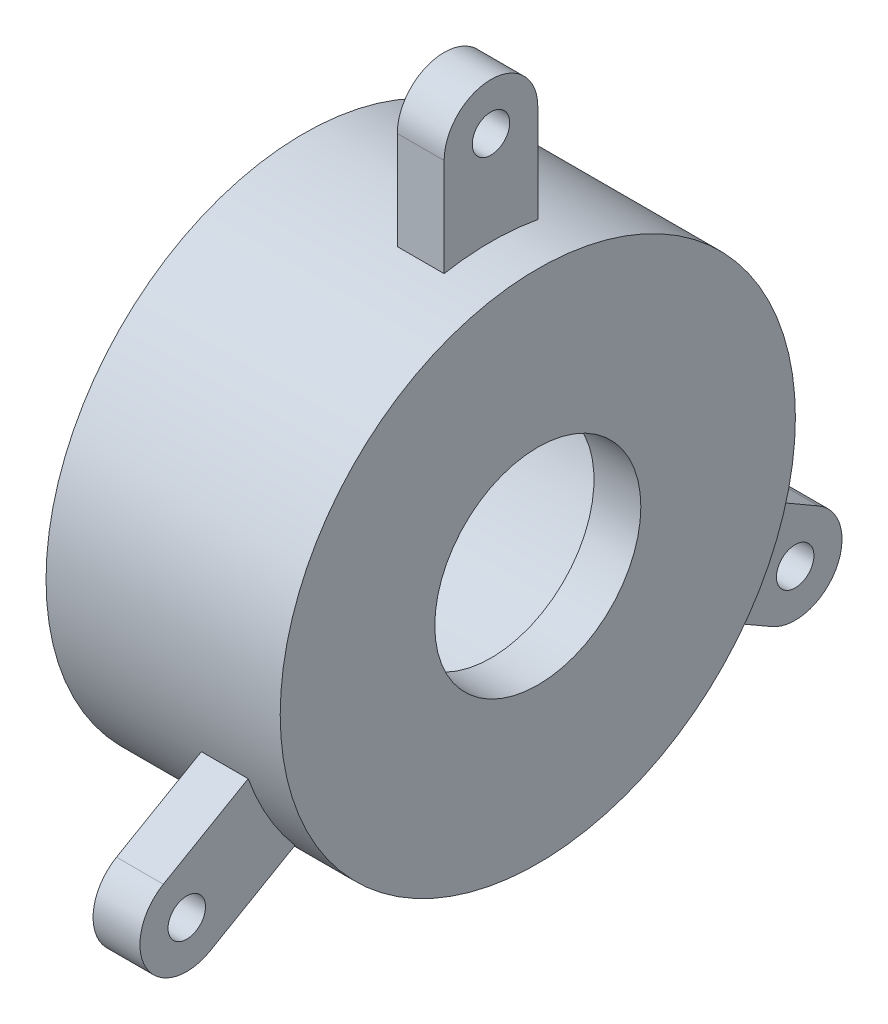
ISO-10303-21;
HEADER;
FILE_DESCRIPTION(('STEP AP214'),'2;1');
FILE_NAME('part.step','',(''),(''),'','','');
FILE_SCHEMA(('AUTOMOTIVE_DESIGN { 1 0 10303 214 1 1 1 1 }'));
ENDSEC;
DATA;
#1=APPLICATION_CONTEXT('core data for automotive mechanical design processes');
#2=APPLICATION_PROTOCOL_DEFINITION('international standard','automotive_design',2000,#1);
#3=PRODUCT_CONTEXT('',#1,'mechanical');
#4=PRODUCT('Part','Part','',(#3));
#5=PRODUCT_RELATED_PRODUCT_CATEGORY('part','',(#4));
#6=PRODUCT_DEFINITION_FORMATION('','',#4);
#7=PRODUCT_DEFINITION_CONTEXT('part definition',#1,'design');
#8=PRODUCT_DEFINITION('design','',#6,#7);
#9=PRODUCT_DEFINITION_SHAPE('','',#8);
#10=(LENGTH_UNIT() NAMED_UNIT(*) SI_UNIT(.MILLI.,.METRE.));
#11=(NAMED_UNIT(*) PLANE_ANGLE_UNIT() SI_UNIT($,.RADIAN.));
#12=(NAMED_UNIT(*) SI_UNIT($,.STERADIAN.) SOLID_ANGLE_UNIT());
#13=UNCERTAINTY_MEASURE_WITH_UNIT(LENGTH_MEASURE(1.E-05),#10,'distance_accuracy_value','');
#14=(GEOMETRIC_REPRESENTATION_CONTEXT(3) GLOBAL_UNCERTAINTY_ASSIGNED_CONTEXT((#13)) GLOBAL_UNIT_ASSIGNED_CONTEXT((#10,
#11,#12)) REPRESENTATION_CONTEXT('',''));
#15=CARTESIAN_POINT('',(0.,0.,0.));
#16=DIRECTION('',(0.,0.,1.));
#17=DIRECTION('',(1.,0.,0.));
#18=AXIS2_PLACEMENT_3D('',#15,#16,#17);
#19=CARTESIAN_POINT('',(-32.4507817086863,0.,0.));
#20=DIRECTION('',(-1.,0.,0.));
#21=DIRECTION('',(0.,0.,1.));
#22=AXIS2_PLACEMENT_3D('',#19,#20,#21);
#23=CYLINDRICAL_SURFACE('',#22,55.);
#24=CARTESIAN_POINT('',(30.,0.,0.));
#25=DIRECTION('',(1.,0.,0.));
#26=DIRECTION('',(0.,0.,-1.));
#27=AXIS2_PLACEMENT_3D('',#24,#25,#26);
#28=CIRCLE('',#27,55.);
#29=CARTESIAN_POINT('',(30.,-18.381380528135,51.8374849879882));
#30=VERTEX_POINT('',#29);
#31=CARTESIAN_POINT('',(30.,-35.7018886038239,41.8374849879883));
#32=VERTEX_POINT('',#31);
#33=EDGE_CURVE('E11',#30,#32,#28,.T.);
#34=ORIENTED_EDGE('',*,*,#33,.F.);
#35=DIRECTION('',(-1.,0.,0.));
#36=VECTOR('',#35,1.);
#37=CARTESIAN_POINT('',(-32.4507817086863,-18.381380528135,51.8374849879882));
#38=LINE('',#37,#36);
#39=CARTESIAN_POINT('',(40.,-18.381380528135,51.8374849879882));
#40=VERTEX_POINT('',#39);
#41=EDGE_CURVE('E43',#30,#40,#38,.F.);
#42=ORIENTED_EDGE('',*,*,#41,.T.);
#43=CARTESIAN_POINT('',(40.,0.,0.));
#44=DIRECTION('',(1.,0.,0.));
#45=DIRECTION('',(0.,0.,-1.));
#46=AXIS2_PLACEMENT_3D('',#43,#44,#45);
#47=CIRCLE('',#46,55.);
#48=CARTESIAN_POINT('',(40.,-35.7018886038239,41.8374849879883));
#49=VERTEX_POINT('',#48);
#50=EDGE_CURVE('E242',#40,#49,#47,.T.);
#51=ORIENTED_EDGE('',*,*,#50,.T.);
#52=DIRECTION('',(-1.,0.,0.));
#53=VECTOR('',#52,1.);
#54=CARTESIAN_POINT('',(-32.4507817086863,-35.7018886038239,41.8374849879883));
#55=LINE('',#54,#53);
#56=EDGE_CURVE('E245',#49,#32,#55,.T.);
#57=ORIENTED_EDGE('',*,*,#56,.T.);
#58=EDGE_LOOP('',(#34,#42,#51,#57));
#59=FACE_BOUND('',#58,.T.);
#60=CARTESIAN_POINT('',(30.,0.,0.));
#61=DIRECTION('',(1.,0.,0.));
#62=DIRECTION('',(0.,0.,-1.));
#63=AXIS2_PLACEMENT_3D('',#60,#61,#62);
#64=CIRCLE('',#63,55.);
#65=CARTESIAN_POINT('',(30.,54.0832691319598,-10.));
#66=VERTEX_POINT('',#65);
#67=CARTESIAN_POINT('',(30.,54.0832691319598,10.));
#68=VERTEX_POINT('',#67);
#69=EDGE_CURVE('E229',#66,#68,#64,.T.);
#70=ORIENTED_EDGE('',*,*,#69,.F.);
#71=DIRECTION('',(-1.,0.,0.));
#72=VECTOR('',#71,1.);
#73=CARTESIAN_POINT('',(-32.4507817086863,54.0832691319598,-10.));
#74=LINE('',#73,#72);
#75=CARTESIAN_POINT('',(40.,54.0832691319598,-10.));
#76=VERTEX_POINT('',#75);
#77=EDGE_CURVE('E226',#66,#76,#74,.F.);
#78=ORIENTED_EDGE('',*,*,#77,.T.);
#79=CARTESIAN_POINT('',(40.,0.,0.));
#80=DIRECTION('',(1.,0.,0.));
#81=DIRECTION('',(0.,0.,-1.));
#82=AXIS2_PLACEMENT_3D('',#79,#80,#81);
#83=CIRCLE('',#82,55.);
#84=CARTESIAN_POINT('',(40.,54.0832691319598,10.));
#85=VERTEX_POINT('',#84);
#86=EDGE_CURVE('E220',#76,#85,#83,.T.);
#87=ORIENTED_EDGE('',*,*,#86,.T.);
#88=DIRECTION('',(-1.,0.,0.));
#89=VECTOR('',#88,1.);
#90=CARTESIAN_POINT('',(-32.4507817086863,54.0832691319598,10.));
#91=LINE('',#90,#89);
#92=EDGE_CURVE('E223',#85,#68,#91,.T.);
#93=ORIENTED_EDGE('',*,*,#92,.T.);
#94=EDGE_LOOP('',(#70,#78,#87,#93));
#95=FACE_BOUND('',#94,.T.);
#96=CARTESIAN_POINT('',(0.,0.,0.));
#97=DIRECTION('',(-1.,0.,0.));
#98=DIRECTION('',(0.,0.,1.));
#99=AXIS2_PLACEMENT_3D('',#96,#97,#98);
#100=CIRCLE('',#99,55.);
#101=CARTESIAN_POINT('',(0.,0.,55.));
#102=VERTEX_POINT('',#101);
#103=EDGE_CURVE('E207',#102,#102,#100,.T.);
#104=ORIENTED_EDGE('',*,*,#103,.F.);
#105=EDGE_LOOP('',(#104));
#106=FACE_BOUND('',#105,.T.);
#107=CARTESIAN_POINT('',(30.,0.,0.));
#108=DIRECTION('',(1.,0.,0.));
#109=DIRECTION('',(0.,0.,-1.));
#110=AXIS2_PLACEMENT_3D('',#107,#108,#109);
#111=CIRCLE('',#110,55.);
#112=CARTESIAN_POINT('',(30.,-35.7018886038245,-41.8374849879878));
#113=VERTEX_POINT('',#112);
#114=CARTESIAN_POINT('',(30.,-18.3813805281358,-51.8374849879879));
#115=VERTEX_POINT('',#114);
#116=EDGE_CURVE('E240',#113,#115,#111,.T.);
#117=ORIENTED_EDGE('',*,*,#116,.F.);
#118=DIRECTION('',(-1.,0.,0.));
#119=VECTOR('',#118,1.);
#120=CARTESIAN_POINT('',(-32.4507817086863,-35.7018886038245,-41.8374849879878));
#121=LINE('',#120,#119);
#122=CARTESIAN_POINT('',(40.,-35.7018886038245,-41.8374849879878));
#123=VERTEX_POINT('',#122);
#124=EDGE_CURVE('E237',#113,#123,#121,.F.);
#125=ORIENTED_EDGE('',*,*,#124,.T.);
#126=CARTESIAN_POINT('',(40.,0.,0.));
#127=DIRECTION('',(1.,0.,0.));
#128=DIRECTION('',(0.,0.,-1.));
#129=AXIS2_PLACEMENT_3D('',#126,#127,#128);
#130=CIRCLE('',#129,55.);
#131=CARTESIAN_POINT('',(40.,-18.3813805281358,-51.8374849879879));
#132=VERTEX_POINT('',#131);
#133=EDGE_CURVE('E231',#123,#132,#130,.T.);
#134=ORIENTED_EDGE('',*,*,#133,.T.);
#135=DIRECTION('',(-1.,0.,0.));
#136=VECTOR('',#135,1.);
#137=CARTESIAN_POINT('',(-32.4507817086863,-18.3813805281358,-51.8374849879879));
#138=LINE('',#137,#136);
#139=EDGE_CURVE('E234',#132,#115,#138,.T.);
#140=ORIENTED_EDGE('',*,*,#139,.T.);
#141=EDGE_LOOP('',(#117,#125,#134,#140));
#142=FACE_BOUND('',#141,.T.);
#143=CARTESIAN_POINT('',(50.,0.,0.));
#144=DIRECTION('',(1.,0.,0.));
#145=DIRECTION('',(0.,0.,-1.));
#146=AXIS2_PLACEMENT_3D('',#143,#144,#145);
#147=CIRCLE('',#146,55.);
#148=CARTESIAN_POINT('',(50.,0.,-55.));
#149=VERTEX_POINT('',#148);
#150=EDGE_CURVE('E260',#149,#149,#147,.T.);
#151=ORIENTED_EDGE('',*,*,#150,.F.);
#152=EDGE_LOOP('',(#151));
#153=FACE_BOUND('',#152,.T.);
#154=ADVANCED_FACE('F36',(#59,#95,#106,#142,#153),#23,.T.);
#155=CARTESIAN_POINT('',(-32.4507817086863,0.,0.));
#156=DIRECTION('',(-1.,0.,0.));
#157=DIRECTION('',(0.,0.,1.));
#158=AXIS2_PLACEMENT_3D('',#155,#156,#157);
#159=CYLINDRICAL_SURFACE('',#158,22.);
#160=CARTESIAN_POINT('',(40.,0.,0.));
#161=DIRECTION('',(-1.,0.,0.));
#162=DIRECTION('',(0.,0.,1.));
#163=AXIS2_PLACEMENT_3D('',#160,#161,#162);
#164=CIRCLE('',#163,22.);
#165=CARTESIAN_POINT('',(40.,0.,22.));
#166=VERTEX_POINT('',#165);
#167=EDGE_CURVE('E217',#166,#166,#164,.T.);
#168=ORIENTED_EDGE('',*,*,#167,.T.);
#169=EDGE_LOOP('',(#168));
#170=FACE_BOUND('',#169,.T.);
#171=CARTESIAN_POINT('',(50.,0.,0.));
#172=DIRECTION('',(1.,0.,0.));
#173=DIRECTION('',(0.,0.,-1.));
#174=AXIS2_PLACEMENT_3D('',#171,#172,#173);
#175=CIRCLE('',#174,22.);
#176=CARTESIAN_POINT('',(50.,0.,-22.));
#177=VERTEX_POINT('',#176);
#178=EDGE_CURVE('E263',#177,#177,#175,.T.);
#179=ORIENTED_EDGE('',*,*,#178,.T.);
#180=EDGE_LOOP('',(#179));
#181=FACE_BOUND('',#180,.T.);
#182=ADVANCED_FACE('F271',(#170,#181),#159,.F.);
#183=CARTESIAN_POINT('',(40.,40.,0.));
#184=DIRECTION('',(1.,0.,0.));
#185=DIRECTION('',(0.,0.,-1.));
#186=AXIS2_PLACEMENT_3D('',#183,#184,#185);
#187=PLANE('',#186);
#188=ORIENTED_EDGE('',*,*,#167,.F.);
#189=EDGE_LOOP('',(#188));
#190=FACE_BOUND('',#189,.T.);
#191=CARTESIAN_POINT('',(40.,0.,0.));
#192=DIRECTION('',(-1.,0.,0.));
#193=DIRECTION('',(0.,0.,1.));
#194=AXIS2_PLACEMENT_3D('',#191,#192,#193);
#195=CIRCLE('',#194,40.);
#196=CARTESIAN_POINT('',(40.,0.,40.));
#197=VERTEX_POINT('',#196);
#198=EDGE_CURVE('E214',#197,#197,#195,.T.);
#199=ORIENTED_EDGE('',*,*,#198,.T.);
#200=EDGE_LOOP('',(#199));
#201=FACE_BOUND('',#200,.T.);
#202=ADVANCED_FACE('F285',(#190,#201),#187,.F.);
#203=CARTESIAN_POINT('',(-32.4507817086863,0.,0.));
#204=DIRECTION('',(-1.,0.,0.));
#205=DIRECTION('',(0.,0.,1.));
#206=AXIS2_PLACEMENT_3D('',#203,#204,#205);
#207=CYLINDRICAL_SURFACE('',#206,40.);
#208=ORIENTED_EDGE('',*,*,#198,.F.);
#209=EDGE_LOOP('',(#208));
#210=FACE_BOUND('',#209,.T.);
#211=CARTESIAN_POINT('',(0.,0.,0.));
#212=DIRECTION('',(-1.,0.,0.));
#213=DIRECTION('',(0.,0.,1.));
#214=AXIS2_PLACEMENT_3D('',#211,#212,#213);
#215=CIRCLE('',#214,40.);
#216=CARTESIAN_POINT('',(0.,0.,40.));
#217=VERTEX_POINT('',#216);
#218=EDGE_CURVE('E211',#217,#217,#215,.T.);
#219=ORIENTED_EDGE('',*,*,#218,.T.);
#220=EDGE_LOOP('',(#219));
#221=FACE_BOUND('',#220,.T.);
#222=ADVANCED_FACE('F290',(#210,#221),#207,.F.);
#223=CARTESIAN_POINT('',(0.,40.,0.));
#224=DIRECTION('',(1.,0.,0.));
#225=DIRECTION('',(0.,0.,-1.));
#226=AXIS2_PLACEMENT_3D('',#223,#224,#225);
#227=PLANE('',#226);
#228=ORIENTED_EDGE('',*,*,#218,.F.);
#229=EDGE_LOOP('',(#228));
#230=FACE_BOUND('',#229,.T.);
#231=ORIENTED_EDGE('',*,*,#103,.T.);
#232=EDGE_LOOP('',(#231));
#233=FACE_BOUND('',#232,.T.);
#234=ADVANCED_FACE('F296',(#230,#233),#227,.F.);
#235=CARTESIAN_POINT('',(30.,51.1005512482579,-10.));
#236=DIRECTION('',(0.,0.,-1.));
#237=DIRECTION('',(-1.,0.,0.));
#238=AXIS2_PLACEMENT_3D('',#235,#236,#237);
#239=PLANE('',#238);
#240=ORIENTED_EDGE('',*,*,#77,.F.);
#241=DIRECTION('',(0.,1.,0.));
#242=VECTOR('',#241,1.);
#243=CARTESIAN_POINT('',(30.,51.1005512482579,-10.));
#244=LINE('',#243,#242);
#245=CARTESIAN_POINT('',(30.,75.,-10.));
#246=VERTEX_POINT('',#245);
#247=EDGE_CURVE('E196',#66,#246,#244,.T.);
#248=ORIENTED_EDGE('',*,*,#247,.T.);
#249=DIRECTION('',(1.,0.,0.));
#250=VECTOR('',#249,1.);
#251=CARTESIAN_POINT('',(30.,75.,-10.));
#252=LINE('',#251,#250);
#253=CARTESIAN_POINT('',(40.,75.,-10.));
#254=VERTEX_POINT('',#253);
#255=EDGE_CURVE('E204',#246,#254,#252,.T.);
#256=ORIENTED_EDGE('',*,*,#255,.T.);
#257=DIRECTION('',(0.,1.,0.));
#258=VECTOR('',#257,1.);
#259=CARTESIAN_POINT('',(40.,51.1005512482579,-10.));
#260=LINE('',#259,#258);
#261=EDGE_CURVE('E193',#76,#254,#260,.T.);
#262=ORIENTED_EDGE('',*,*,#261,.F.);
#263=EDGE_LOOP('',(#240,#248,#256,#262));
#264=FACE_BOUND('',#263,.T.);
#265=ADVANCED_FACE('F300',(#264),#239,.T.);
#266=CARTESIAN_POINT('',(30.,51.1005512482579,10.));
#267=DIRECTION('',(0.,0.,1.));
#268=DIRECTION('',(1.,0.,0.));
#269=AXIS2_PLACEMENT_3D('',#266,#267,#268);
#270=PLANE('',#269);
#271=ORIENTED_EDGE('',*,*,#92,.F.);
#272=DIRECTION('',(0.,-1.,0.));
#273=VECTOR('',#272,1.);
#274=CARTESIAN_POINT('',(40.,51.1005512482579,10.));
#275=LINE('',#274,#273);
#276=CARTESIAN_POINT('',(40.,75.,10.));
#277=VERTEX_POINT('',#276);
#278=EDGE_CURVE('E201',#277,#85,#275,.T.);
#279=ORIENTED_EDGE('',*,*,#278,.F.);
#280=DIRECTION('',(1.,0.,0.));
#281=VECTOR('',#280,1.);
#282=CARTESIAN_POINT('',(30.,75.,10.));
#283=LINE('',#282,#281);
#284=CARTESIAN_POINT('',(30.,75.,10.));
#285=VERTEX_POINT('',#284);
#286=EDGE_CURVE('E198',#285,#277,#283,.T.);
#287=ORIENTED_EDGE('',*,*,#286,.F.);
#288=DIRECTION('',(0.,-1.,0.));
#289=VECTOR('',#288,1.);
#290=CARTESIAN_POINT('',(30.,51.1005512482579,10.));
#291=LINE('',#290,#289);
#292=EDGE_CURVE('E192',#285,#68,#291,.T.);
#293=ORIENTED_EDGE('',*,*,#292,.T.);
#294=EDGE_LOOP('',(#271,#279,#287,#293));
#295=FACE_BOUND('',#294,.T.);
#296=ADVANCED_FACE('F306',(#295),#270,.T.);
#297=CARTESIAN_POINT('',(30.,75.,0.));
#298=DIRECTION('',(1.,0.,0.));
#299=DIRECTION('',(0.,0.,-1.));
#300=AXIS2_PLACEMENT_3D('',#297,#298,#299);
#301=CYLINDRICAL_SURFACE('',#300,10.);
#302=CARTESIAN_POINT('',(40.,75.,0.));
#303=DIRECTION('',(1.,0.,0.));
#304=DIRECTION('',(0.,0.,-1.));
#305=AXIS2_PLACEMENT_3D('',#302,#303,#304);
#306=CIRCLE('',#305,10.);
#307=EDGE_CURVE('E186',#254,#277,#306,.T.);
#308=ORIENTED_EDGE('',*,*,#307,.F.);
#309=ORIENTED_EDGE('',*,*,#255,.F.);
#310=CARTESIAN_POINT('',(30.,75.,0.));
#311=DIRECTION('',(1.,0.,0.));
#312=DIRECTION('',(0.,0.,-1.));
#313=AXIS2_PLACEMENT_3D('',#310,#311,#312);
#314=CIRCLE('',#313,10.);
#315=EDGE_CURVE('E189',#246,#285,#314,.T.);
#316=ORIENTED_EDGE('',*,*,#315,.T.);
#317=ORIENTED_EDGE('',*,*,#286,.T.);
#318=EDGE_LOOP('',(#308,#309,#316,#317));
#319=FACE_BOUND('',#318,.T.);
#320=ADVANCED_FACE('F302',(#319),#301,.T.);
#321=CARTESIAN_POINT('',(30.,75.,0.));
#322=DIRECTION('',(1.,0.,0.));
#323=DIRECTION('',(0.,0.,-1.));
#324=AXIS2_PLACEMENT_3D('',#321,#322,#323);
#325=PLANE('',#324);
#326=CARTESIAN_POINT('',(30.,75.,0.));
#327=DIRECTION('',(1.,0.,0.));
#328=DIRECTION('',(0.,0.,-1.));
#329=AXIS2_PLACEMENT_3D('',#326,#327,#328);
#330=CIRCLE('',#329,4.);
#331=CARTESIAN_POINT('',(30.,75.,-4.));
#332=VERTEX_POINT('',#331);
#333=EDGE_CURVE('E183',#332,#332,#330,.T.);
#334=ORIENTED_EDGE('',*,*,#333,.T.);
#335=EDGE_LOOP('',(#334));
#336=FACE_BOUND('',#335,.T.);
#337=ORIENTED_EDGE('',*,*,#247,.F.);
#338=ORIENTED_EDGE('',*,*,#69,.T.);
#339=ORIENTED_EDGE('',*,*,#292,.F.);
#340=ORIENTED_EDGE('',*,*,#315,.F.);
#341=EDGE_LOOP('',(#337,#338,#339,#340));
#342=FACE_BOUND('',#341,.T.);
#343=ADVANCED_FACE('F305',(#336,#342),#325,.F.);
#344=CARTESIAN_POINT('',(40.,75.,0.));
#345=DIRECTION('',(1.,0.,0.));
#346=DIRECTION('',(0.,0.,-1.));
#347=AXIS2_PLACEMENT_3D('',#344,#345,#346);
#348=PLANE('',#347);
#349=ORIENTED_EDGE('',*,*,#86,.F.);
#350=ORIENTED_EDGE('',*,*,#261,.T.);
#351=ORIENTED_EDGE('',*,*,#307,.T.);
#352=ORIENTED_EDGE('',*,*,#278,.T.);
#353=EDGE_LOOP('',(#349,#350,#351,#352));
#354=FACE_BOUND('',#353,.T.);
#355=CARTESIAN_POINT('',(40.,75.,0.));
#356=DIRECTION('',(1.,0.,0.));
#357=DIRECTION('',(0.,0.,-1.));
#358=AXIS2_PLACEMENT_3D('',#355,#356,#357);
#359=CIRCLE('',#358,4.);
#360=CARTESIAN_POINT('',(40.,75.,-4.));
#361=VERTEX_POINT('',#360);
#362=EDGE_CURVE('E181',#361,#361,#359,.T.);
#363=ORIENTED_EDGE('',*,*,#362,.F.);
#364=EDGE_LOOP('',(#363));
#365=FACE_BOUND('',#364,.T.);
#366=ADVANCED_FACE('F314',(#354,#365),#348,.T.);
#367=CARTESIAN_POINT('',(30.,75.,0.));
#368=DIRECTION('',(1.,0.,0.));
#369=DIRECTION('',(0.,0.,-1.));
#370=AXIS2_PLACEMENT_3D('',#367,#368,#369);
#371=CYLINDRICAL_SURFACE('',#370,4.);
#372=ORIENTED_EDGE('',*,*,#333,.F.);
#373=EDGE_LOOP('',(#372));
#374=FACE_BOUND('',#373,.T.);
#375=ORIENTED_EDGE('',*,*,#362,.T.);
#376=EDGE_LOOP('',(#375));
#377=FACE_BOUND('',#376,.T.);
#378=ADVANCED_FACE('F317',(#374,#377),#371,.F.);
#379=CARTESIAN_POINT('',(30.,-34.2105296619735,-39.2543755283798));
#380=DIRECTION('',(0.,-0.866025403784436,0.500000000000004));
#381=DIRECTION('',(0.,-0.500000000000004,-0.866025403784436));
#382=AXIS2_PLACEMENT_3D('',#379,#380,#381);
#383=PLANE('',#382);
#384=ORIENTED_EDGE('',*,*,#124,.F.);
#385=DIRECTION('',(0.,-0.500000000000004,-0.866025403784436));
#386=VECTOR('',#385,1.);
#387=CARTESIAN_POINT('',(30.,-34.2105296619735,-39.2543755283798));
#388=LINE('',#387,#386);
#389=CARTESIAN_POINT('',(30.,-46.1602540378447,-59.9519052838327));
#390=VERTEX_POINT('',#389);
#391=EDGE_CURVE('E172',#113,#390,#388,.T.);
#392=ORIENTED_EDGE('',*,*,#391,.T.);
#393=DIRECTION('',(1.,0.,0.));
#394=VECTOR('',#393,1.);
#395=CARTESIAN_POINT('',(30.,-46.1602540378447,-59.9519052838327));
#396=LINE('',#395,#394);
#397=CARTESIAN_POINT('',(40.,-46.1602540378447,-59.9519052838327));
#398=VERTEX_POINT('',#397);
#399=EDGE_CURVE('E178',#390,#398,#396,.T.);
#400=ORIENTED_EDGE('',*,*,#399,.T.);
#401=DIRECTION('',(0.,-0.500000000000004,-0.866025403784436));
#402=VECTOR('',#401,1.);
#403=CARTESIAN_POINT('',(40.,-34.2105296619735,-39.2543755283798));
#404=LINE('',#403,#402);
#405=EDGE_CURVE('E169',#123,#398,#404,.T.);
#406=ORIENTED_EDGE('',*,*,#405,.F.);
#407=EDGE_LOOP('',(#384,#392,#400,#406));
#408=FACE_BOUND('',#407,.T.);
#409=ADVANCED_FACE('F324',(#408),#383,.T.);
#410=CARTESIAN_POINT('',(30.,-16.8900215862848,-49.2543755283799));
#411=DIRECTION('',(0.,0.866025403784436,-0.500000000000004));
#412=DIRECTION('',(0.,0.500000000000004,0.866025403784436));
#413=AXIS2_PLACEMENT_3D('',#410,#411,#412);
#414=PLANE('',#413);
#415=ORIENTED_EDGE('',*,*,#139,.F.);
#416=DIRECTION('',(0.,0.500000000000004,0.866025403784436));
#417=VECTOR('',#416,1.);
#418=CARTESIAN_POINT('',(40.,-16.8900215862848,-49.2543755283799));
#419=LINE('',#418,#417);
#420=CARTESIAN_POINT('',(40.,-28.8397459621559,-69.9519052838328));
#421=VERTEX_POINT('',#420);
#422=EDGE_CURVE('E58',#421,#132,#419,.T.);
#423=ORIENTED_EDGE('',*,*,#422,.F.);
#424=DIRECTION('',(1.,0.,0.));
#425=VECTOR('',#424,1.);
#426=CARTESIAN_POINT('',(30.,-28.8397459621559,-69.9519052838328));
#427=LINE('',#426,#425);
#428=CARTESIAN_POINT('',(30.,-28.8397459621559,-69.9519052838328));
#429=VERTEX_POINT('',#428);
#430=EDGE_CURVE('E174',#429,#421,#427,.T.);
#431=ORIENTED_EDGE('',*,*,#430,.F.);
#432=DIRECTION('',(0.,0.500000000000004,0.866025403784436));
#433=VECTOR('',#432,1.);
#434=CARTESIAN_POINT('',(30.,-16.8900215862848,-49.2543755283799));
#435=LINE('',#434,#433);
#436=EDGE_CURVE('E168',#429,#115,#435,.T.);
#437=ORIENTED_EDGE('',*,*,#436,.T.);
#438=EDGE_LOOP('',(#415,#423,#431,#437));
#439=FACE_BOUND('',#438,.T.);
#440=ADVANCED_FACE('F330',(#439),#414,.T.);
#441=CARTESIAN_POINT('',(30.,-37.5000000000003,-64.9519052838327));
#442=DIRECTION('',(1.,0.,0.));
#443=DIRECTION('',(0.,0.,-1.));
#444=AXIS2_PLACEMENT_3D('',#441,#442,#443);
#445=CYLINDRICAL_SURFACE('',#444,10.);
#446=CARTESIAN_POINT('',(40.,-37.5000000000003,-64.9519052838327));
#447=DIRECTION('',(1.,0.,0.));
#448=DIRECTION('',(0.,-0.866025403784436,0.500000000000004));
#449=AXIS2_PLACEMENT_3D('',#446,#447,#448);
#450=CIRCLE('',#449,10.);
#451=EDGE_CURVE('E162',#398,#421,#450,.T.);
#452=ORIENTED_EDGE('',*,*,#451,.F.);
#453=ORIENTED_EDGE('',*,*,#399,.F.);
#454=CARTESIAN_POINT('',(30.,-37.5000000000003,-64.9519052838327));
#455=DIRECTION('',(1.,0.,0.));
#456=DIRECTION('',(0.,-0.866025403784436,0.500000000000004));
#457=AXIS2_PLACEMENT_3D('',#454,#455,#456);
#458=CIRCLE('',#457,10.);
#459=EDGE_CURVE('E165',#390,#429,#458,.T.);
#460=ORIENTED_EDGE('',*,*,#459,.T.);
#461=ORIENTED_EDGE('',*,*,#430,.T.);
#462=EDGE_LOOP('',(#452,#453,#460,#461));
#463=FACE_BOUND('',#462,.T.);
#464=ADVANCED_FACE('F326',(#463),#445,.T.);
#465=CARTESIAN_POINT('',(30.,-37.5000000000003,-64.9519052838327));
#466=DIRECTION('',(1.,0.,0.));
#467=DIRECTION('',(0.,-0.866025403784436,0.500000000000004));
#468=AXIS2_PLACEMENT_3D('',#465,#466,#467);
#469=PLANE('',#468);
#470=CARTESIAN_POINT('',(30.,-37.5000000000003,-64.9519052838327));
#471=DIRECTION('',(1.,0.,0.));
#472=DIRECTION('',(0.,-0.866025403784436,0.500000000000004));
#473=AXIS2_PLACEMENT_3D('',#470,#471,#472);
#474=CIRCLE('',#473,4.);
#475=CARTESIAN_POINT('',(30.,-40.9641016151381,-62.9519052838327));
#476=VERTEX_POINT('',#475);
#477=EDGE_CURVE('E159',#476,#476,#474,.T.);
#478=ORIENTED_EDGE('',*,*,#477,.T.);
#479=EDGE_LOOP('',(#478));
#480=FACE_BOUND('',#479,.T.);
#481=ORIENTED_EDGE('',*,*,#391,.F.);
#482=ORIENTED_EDGE('',*,*,#116,.T.);
#483=ORIENTED_EDGE('',*,*,#436,.F.);
#484=ORIENTED_EDGE('',*,*,#459,.F.);
#485=EDGE_LOOP('',(#481,#482,#483,#484));
#486=FACE_BOUND('',#485,.T.);
#487=ADVANCED_FACE('F329',(#480,#486),#469,.F.);
#488=CARTESIAN_POINT('',(40.,-37.5000000000003,-64.9519052838327));
#489=DIRECTION('',(1.,0.,0.));
#490=DIRECTION('',(0.,-0.866025403784436,0.500000000000004));
#491=AXIS2_PLACEMENT_3D('',#488,#489,#490);
#492=PLANE('',#491);
#493=ORIENTED_EDGE('',*,*,#133,.F.);
#494=ORIENTED_EDGE('',*,*,#405,.T.);
#495=ORIENTED_EDGE('',*,*,#451,.T.);
#496=ORIENTED_EDGE('',*,*,#422,.T.);
#497=EDGE_LOOP('',(#493,#494,#495,#496));
#498=FACE_BOUND('',#497,.T.);
#499=CARTESIAN_POINT('',(40.,-37.5000000000003,-64.9519052838327));
#500=DIRECTION('',(1.,0.,0.));
#501=DIRECTION('',(0.,-0.866025403784436,0.500000000000004));
#502=AXIS2_PLACEMENT_3D('',#499,#500,#501);
#503=CIRCLE('',#502,4.);
#504=CARTESIAN_POINT('',(40.,-40.9641016151381,-62.9519052838327));
#505=VERTEX_POINT('',#504);
#506=EDGE_CURVE('E157',#505,#505,#503,.T.);
#507=ORIENTED_EDGE('',*,*,#506,.F.);
#508=EDGE_LOOP('',(#507));
#509=FACE_BOUND('',#508,.T.);
#510=ADVANCED_FACE('F338',(#498,#509),#492,.T.);
#511=CARTESIAN_POINT('',(30.,-37.5000000000003,-64.9519052838327));
#512=DIRECTION('',(1.,0.,0.));
#513=DIRECTION('',(0.,0.,-1.));
#514=AXIS2_PLACEMENT_3D('',#511,#512,#513);
#515=CYLINDRICAL_SURFACE('',#514,4.);
#516=ORIENTED_EDGE('',*,*,#477,.F.);
#517=EDGE_LOOP('',(#516));
#518=FACE_BOUND('',#517,.T.);
#519=ORIENTED_EDGE('',*,*,#506,.T.);
#520=EDGE_LOOP('',(#519));
#521=FACE_BOUND('',#520,.T.);
#522=ADVANCED_FACE('F341',(#518,#521),#515,.F.);
#523=CARTESIAN_POINT('',(30.,-16.8900215862841,49.2543755283801));
#524=DIRECTION('',(0.,0.866025403784443,0.499999999999992));
#525=DIRECTION('',(0.,-0.499999999999992,0.866025403784443));
#526=AXIS2_PLACEMENT_3D('',#523,#524,#525);
#527=PLANE('',#526);
#528=ORIENTED_EDGE('',*,*,#41,.F.);
#529=DIRECTION('',(0.,-0.499999999999992,0.866025403784443));
#530=VECTOR('',#529,1.);
#531=CARTESIAN_POINT('',(30.,-16.8900215862841,49.2543755283801));
#532=LINE('',#531,#530);
#533=CARTESIAN_POINT('',(30.,-28.839745962155,69.9519052838332));
#534=VERTEX_POINT('',#533);
#535=EDGE_CURVE('E133',#30,#534,#532,.T.);
#536=ORIENTED_EDGE('',*,*,#535,.T.);
#537=DIRECTION('',(1.,0.,0.));
#538=VECTOR('',#537,1.);
#539=CARTESIAN_POINT('',(30.,-28.839745962155,69.9519052838332));
#540=LINE('',#539,#538);
#541=CARTESIAN_POINT('',(40.,-28.839745962155,69.9519052838332));
#542=VERTEX_POINT('',#541);
#543=EDGE_CURVE('E132',#534,#542,#540,.T.);
#544=ORIENTED_EDGE('',*,*,#543,.T.);
#545=DIRECTION('',(0.,-0.499999999999992,0.866025403784443));
#546=VECTOR('',#545,1.);
#547=CARTESIAN_POINT('',(40.,-16.8900215862841,49.2543755283801));
#548=LINE('',#547,#546);
#549=EDGE_CURVE('E145',#40,#542,#548,.T.);
#550=ORIENTED_EDGE('',*,*,#549,.F.);
#551=EDGE_LOOP('',(#528,#536,#544,#550));
#552=FACE_BOUND('',#551,.T.);
#553=ADVANCED_FACE('F251',(#552),#527,.T.);
#554=CARTESIAN_POINT('',(30.,-34.210529661973,39.2543755283803));
#555=DIRECTION('',(0.,-0.866025403784443,-0.499999999999992));
#556=DIRECTION('',(0.,0.499999999999992,-0.866025403784443));
#557=AXIS2_PLACEMENT_3D('',#554,#555,#556);
#558=PLANE('',#557);
#559=ORIENTED_EDGE('',*,*,#56,.F.);
#560=DIRECTION('',(0.,0.499999999999992,-0.866025403784443));
#561=VECTOR('',#560,1.);
#562=CARTESIAN_POINT('',(40.,-34.210529661973,39.2543755283803));
#563=LINE('',#562,#561);
#564=CARTESIAN_POINT('',(40.,-46.1602540378438,59.9519052838333));
#565=VERTEX_POINT('',#564);
#566=EDGE_CURVE('E50',#565,#49,#563,.T.);
#567=ORIENTED_EDGE('',*,*,#566,.F.);
#568=DIRECTION('',(1.,0.,0.));
#569=VECTOR('',#568,1.);
#570=CARTESIAN_POINT('',(30.,-46.1602540378438,59.9519052838333));
#571=LINE('',#570,#569);
#572=CARTESIAN_POINT('',(30.,-46.1602540378438,59.9519052838333));
#573=VERTEX_POINT('',#572);
#574=EDGE_CURVE('E124',#573,#565,#571,.T.);
#575=ORIENTED_EDGE('',*,*,#574,.F.);
#576=DIRECTION('',(0.,0.499999999999992,-0.866025403784443));
#577=VECTOR('',#576,1.);
#578=CARTESIAN_POINT('',(30.,-34.210529661973,39.2543755283803));
#579=LINE('',#578,#577);
#580=EDGE_CURVE('E127',#573,#32,#579,.T.);
#581=ORIENTED_EDGE('',*,*,#580,.T.);
#582=EDGE_LOOP('',(#559,#567,#575,#581));
#583=FACE_BOUND('',#582,.T.);
#584=ADVANCED_FACE('F126',(#583),#558,.T.);
#585=CARTESIAN_POINT('',(30.,-37.4999999999994,64.9519052838332));
#586=DIRECTION('',(1.,0.,0.));
#587=DIRECTION('',(0.,0.,-1.));
#588=AXIS2_PLACEMENT_3D('',#585,#586,#587);
#589=CYLINDRICAL_SURFACE('',#588,10.);
#590=CARTESIAN_POINT('',(40.,-37.4999999999994,64.9519052838332));
#591=DIRECTION('',(1.,0.,0.));
#592=DIRECTION('',(0.,0.866025403784443,0.499999999999992));
#593=AXIS2_PLACEMENT_3D('',#590,#591,#592);
#594=CIRCLE('',#593,10.);
#595=EDGE_CURVE('E153',#542,#565,#594,.T.);
#596=ORIENTED_EDGE('',*,*,#595,.F.);
#597=ORIENTED_EDGE('',*,*,#543,.F.);
#598=CARTESIAN_POINT('',(30.,-37.4999999999994,64.9519052838332));
#599=DIRECTION('',(1.,0.,0.));
#600=DIRECTION('',(0.,0.866025403784443,0.499999999999992));
#601=AXIS2_PLACEMENT_3D('',#598,#599,#600);
#602=CIRCLE('',#601,10.);
#603=EDGE_CURVE('E139',#534,#573,#602,.T.);
#604=ORIENTED_EDGE('',*,*,#603,.T.);
#605=ORIENTED_EDGE('',*,*,#574,.T.);
#606=EDGE_LOOP('',(#596,#597,#604,#605));
#607=FACE_BOUND('',#606,.T.);
#608=ADVANCED_FACE('F143',(#607),#589,.T.);
#609=CARTESIAN_POINT('',(30.,-37.4999999999994,64.9519052838332));
#610=DIRECTION('',(1.,0.,0.));
#611=DIRECTION('',(0.,0.866025403784443,0.499999999999992));
#612=AXIS2_PLACEMENT_3D('',#609,#610,#611);
#613=PLANE('',#612);
#614=CARTESIAN_POINT('',(30.,-37.4999999999994,64.9519052838332));
#615=DIRECTION('',(1.,0.,0.));
#616=DIRECTION('',(0.,0.866025403784443,0.499999999999992));
#617=AXIS2_PLACEMENT_3D('',#614,#615,#616);
#618=CIRCLE('',#617,4.);
#619=CARTESIAN_POINT('',(30.,-34.0358983848616,66.9519052838332));
#620=VERTEX_POINT('',#619);
#621=EDGE_CURVE('E155',#620,#620,#618,.T.);
#622=ORIENTED_EDGE('',*,*,#621,.T.);
#623=EDGE_LOOP('',(#622));
#624=FACE_BOUND('',#623,.T.);
#625=ORIENTED_EDGE('',*,*,#535,.F.);
#626=ORIENTED_EDGE('',*,*,#33,.T.);
#627=ORIENTED_EDGE('',*,*,#580,.F.);
#628=ORIENTED_EDGE('',*,*,#603,.F.);
#629=EDGE_LOOP('',(#625,#626,#627,#628));
#630=FACE_BOUND('',#629,.T.);
#631=ADVANCED_FACE('F138',(#624,#630),#613,.F.);
#632=CARTESIAN_POINT('',(40.,-37.4999999999994,64.9519052838332));
#633=DIRECTION('',(1.,0.,0.));
#634=DIRECTION('',(0.,0.866025403784443,0.499999999999992));
#635=AXIS2_PLACEMENT_3D('',#632,#633,#634);
#636=PLANE('',#635);
#637=ORIENTED_EDGE('',*,*,#50,.F.);
#638=ORIENTED_EDGE('',*,*,#549,.T.);
#639=ORIENTED_EDGE('',*,*,#595,.T.);
#640=ORIENTED_EDGE('',*,*,#566,.T.);
#641=EDGE_LOOP('',(#637,#638,#639,#640));
#642=FACE_BOUND('',#641,.T.);
#643=CARTESIAN_POINT('',(40.,-37.4999999999994,64.9519052838332));
#644=DIRECTION('',(1.,0.,0.));
#645=DIRECTION('',(0.,0.866025403784443,0.499999999999992));
#646=AXIS2_PLACEMENT_3D('',#643,#644,#645);
#647=CIRCLE('',#646,4.);
#648=CARTESIAN_POINT('',(40.,-34.0358983848616,66.9519052838332));
#649=VERTEX_POINT('',#648);
#650=EDGE_CURVE('E149',#649,#649,#647,.T.);
#651=ORIENTED_EDGE('',*,*,#650,.F.);
#652=EDGE_LOOP('',(#651));
#653=FACE_BOUND('',#652,.T.);
#654=ADVANCED_FACE('F252',(#642,#653),#636,.T.);
#655=CARTESIAN_POINT('',(30.,-37.4999999999994,64.9519052838332));
#656=DIRECTION('',(1.,0.,0.));
#657=DIRECTION('',(0.,0.,-1.));
#658=AXIS2_PLACEMENT_3D('',#655,#656,#657);
#659=CYLINDRICAL_SURFACE('',#658,4.);
#660=ORIENTED_EDGE('',*,*,#621,.F.);
#661=EDGE_LOOP('',(#660));
#662=FACE_BOUND('',#661,.T.);
#663=ORIENTED_EDGE('',*,*,#650,.T.);
#664=EDGE_LOOP('',(#663));
#665=FACE_BOUND('',#664,.T.);
#666=ADVANCED_FACE('F255',(#662,#665),#659,.F.);
#667=CARTESIAN_POINT('',(50.,0.,0.));
#668=DIRECTION('',(1.,0.,0.));
#669=DIRECTION('',(0.,0.,-1.));
#670=AXIS2_PLACEMENT_3D('',#667,#668,#669);
#671=PLANE('',#670);
#672=ORIENTED_EDGE('',*,*,#178,.F.);
#673=EDGE_LOOP('',(#672));
#674=FACE_BOUND('',#673,.T.);
#675=ORIENTED_EDGE('',*,*,#150,.T.);
#676=EDGE_LOOP('',(#675));
#677=FACE_BOUND('',#676,.T.);
#678=ADVANCED_FACE('F273',(#674,#677),#671,.T.);
#679=CLOSED_SHELL('',(#154,#182,#202,#222,#234,#265,#296,#320,#343,#366,#378,#409,#440,#464,
#487,#510,#522,#553,#584,#608,#631,#654,#666,#678));
#680=MANIFOLD_SOLID_BREP('B2',#679);
#681=ADVANCED_BREP_SHAPE_REPRESENTATION('',(#18,#680),#14);
#682=SHAPE_DEFINITION_REPRESENTATION(#9,#681);
ENDSEC;
END-ISO-10303-21;
